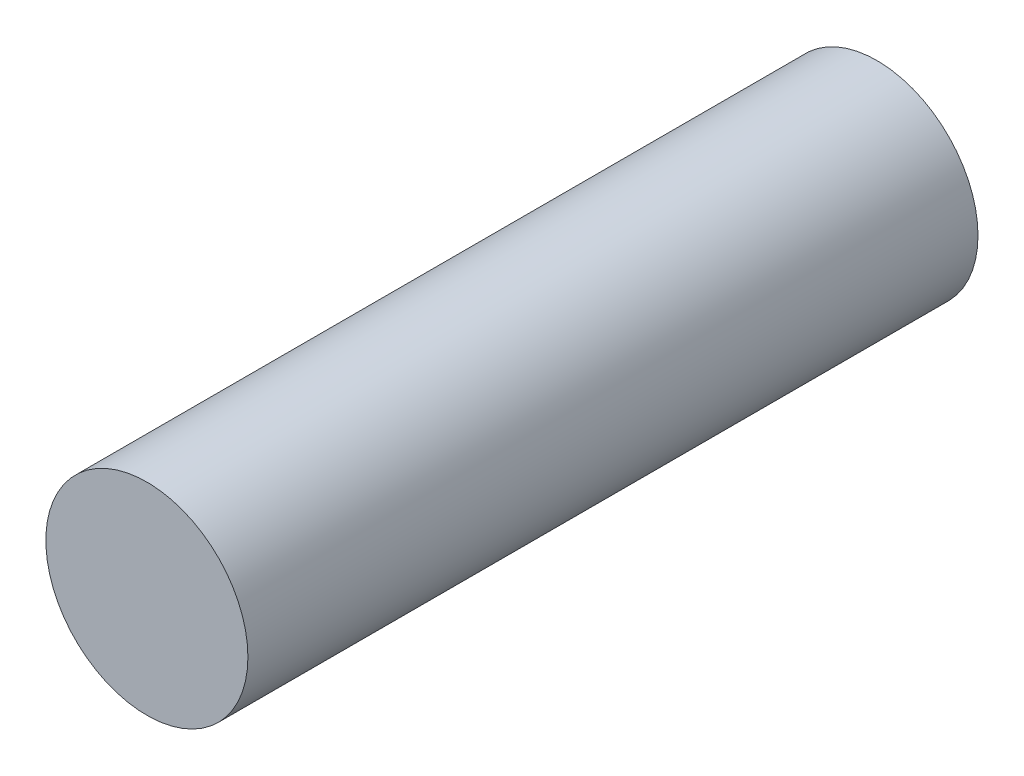
ISO-10303-21;
HEADER;
FILE_DESCRIPTION(('STEP AP214'),'2;1');
FILE_NAME('part.step','',(''),(''),'','','');
FILE_SCHEMA(('AUTOMOTIVE_DESIGN { 1 0 10303 214 1 1 1 1 }'));
ENDSEC;
DATA;
#1=APPLICATION_CONTEXT('core data for automotive mechanical design processes');
#2=APPLICATION_PROTOCOL_DEFINITION('international standard','automotive_design',2000,#1);
#3=PRODUCT_CONTEXT('',#1,'mechanical');
#4=PRODUCT('Part','Part','',(#3));
#5=PRODUCT_RELATED_PRODUCT_CATEGORY('part','',(#4));
#6=PRODUCT_DEFINITION_FORMATION('','',#4);
#7=PRODUCT_DEFINITION_CONTEXT('part definition',#1,'design');
#8=PRODUCT_DEFINITION('design','',#6,#7);
#9=PRODUCT_DEFINITION_SHAPE('','',#8);
#10=(LENGTH_UNIT() NAMED_UNIT(*) SI_UNIT(.MILLI.,.METRE.));
#11=(NAMED_UNIT(*) PLANE_ANGLE_UNIT() SI_UNIT($,.RADIAN.));
#12=(NAMED_UNIT(*) SI_UNIT($,.STERADIAN.) SOLID_ANGLE_UNIT());
#13=UNCERTAINTY_MEASURE_WITH_UNIT(LENGTH_MEASURE(1.E-05),#10,'distance_accuracy_value','');
#14=(GEOMETRIC_REPRESENTATION_CONTEXT(3) GLOBAL_UNCERTAINTY_ASSIGNED_CONTEXT((#13)) GLOBAL_UNIT_ASSIGNED_CONTEXT((#10,
#11,#12)) REPRESENTATION_CONTEXT('',''));
#15=CARTESIAN_POINT('',(0.,0.,0.));
#16=DIRECTION('',(0.,0.,1.));
#17=DIRECTION('',(1.,0.,0.));
#18=AXIS2_PLACEMENT_3D('',#15,#16,#17);
#19=CARTESIAN_POINT('',(0.,0.,27.459060435492));
#20=DIRECTION('',(0.,0.,-1.));
#21=DIRECTION('',(-1.,0.,0.));
#22=AXIS2_PLACEMENT_3D('',#19,#20,#21);
#23=CYLINDRICAL_SURFACE('',#22,3.8);
#24=CARTESIAN_POINT('',(0.,0.,27.459060435492));
#25=DIRECTION('',(0.,0.,1.));
#26=DIRECTION('',(1.,0.,0.));
#27=AXIS2_PLACEMENT_3D('',#24,#25,#26);
#28=CIRCLE('',#27,3.8);
#29=CARTESIAN_POINT('',(3.8,0.,27.459060435492));
#30=VERTEX_POINT('',#29);
#31=EDGE_CURVE('E10',#30,#30,#28,.T.);
#32=ORIENTED_EDGE('',*,*,#31,.F.);
#33=EDGE_LOOP('',(#32));
#34=FACE_BOUND('',#33,.T.);
#35=CARTESIAN_POINT('',(0.,0.,0.));
#36=DIRECTION('',(0.,0.,1.));
#37=DIRECTION('',(1.,0.,0.));
#38=AXIS2_PLACEMENT_3D('',#35,#36,#37);
#39=CIRCLE('',#38,3.8);
#40=CARTESIAN_POINT('',(3.8,0.,0.));
#41=VERTEX_POINT('',#40);
#42=EDGE_CURVE('E40',#41,#41,#39,.T.);
#43=ORIENTED_EDGE('',*,*,#42,.T.);
#44=EDGE_LOOP('',(#43));
#45=FACE_BOUND('',#44,.T.);
#46=ADVANCED_FACE('F37',(#34,#45),#23,.T.);
#47=CARTESIAN_POINT('',(0.,0.,27.459060435492));
#48=DIRECTION('',(0.,0.,1.));
#49=DIRECTION('',(1.,0.,0.));
#50=AXIS2_PLACEMENT_3D('',#47,#48,#49);
#51=PLANE('',#50);
#52=ORIENTED_EDGE('',*,*,#31,.T.);
#53=EDGE_LOOP('',(#52));
#54=FACE_BOUND('',#53,.T.);
#55=ADVANCED_FACE('F52',(#54),#51,.T.);
#56=CARTESIAN_POINT('',(0.,0.,0.));
#57=DIRECTION('',(0.,0.,1.));
#58=DIRECTION('',(1.,0.,0.));
#59=AXIS2_PLACEMENT_3D('',#56,#57,#58);
#60=PLANE('',#59);
#61=ORIENTED_EDGE('',*,*,#42,.F.);
#62=EDGE_LOOP('',(#61));
#63=FACE_BOUND('',#62,.T.);
#64=ADVANCED_FACE('F50',(#63),#60,.F.);
#65=CLOSED_SHELL('',(#46,#55,#64));
#66=MANIFOLD_SOLID_BREP('B2',#65);
#67=ADVANCED_BREP_SHAPE_REPRESENTATION('',(#18,#66),#14);
#68=SHAPE_DEFINITION_REPRESENTATION(#9,#67);
ENDSEC;
END-ISO-10303-21;
